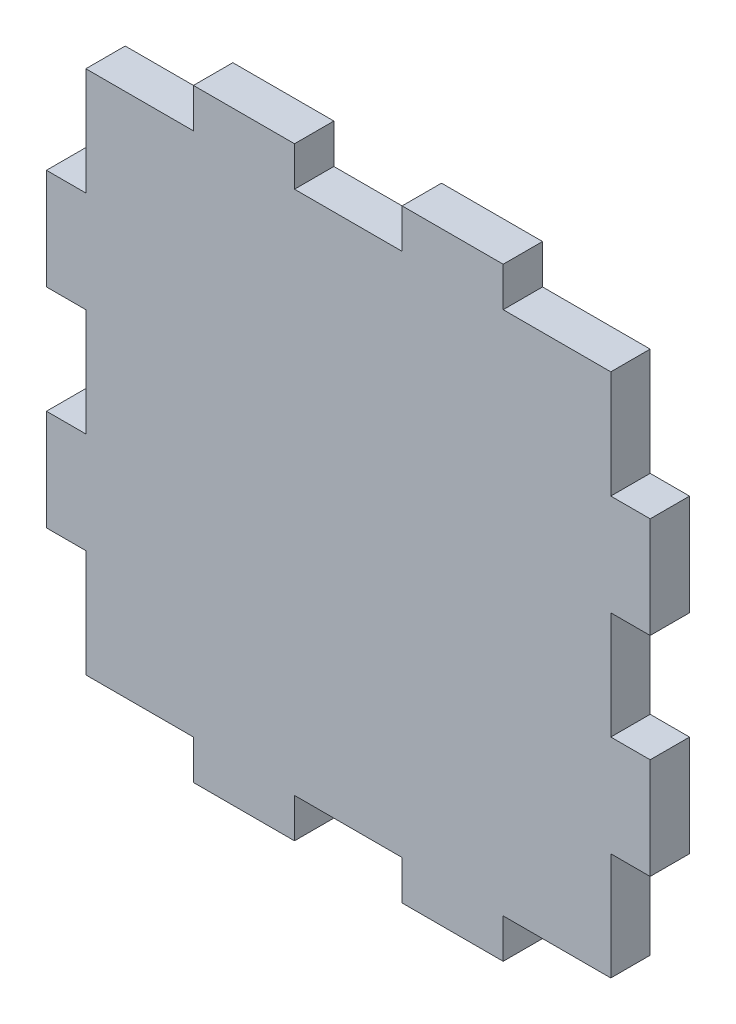
ISO-10303-21;
HEADER;
FILE_DESCRIPTION(('STEP AP214'),'2;1');
FILE_NAME('part.step','',(''),(''),'','','');
FILE_SCHEMA(('AUTOMOTIVE_DESIGN { 1 0 10303 214 1 1 1 1 }'));
ENDSEC;
DATA;
#1=APPLICATION_CONTEXT('core data for automotive mechanical design processes');
#2=APPLICATION_PROTOCOL_DEFINITION('international standard','automotive_design',2000,#1);
#3=PRODUCT_CONTEXT('',#1,'mechanical');
#4=PRODUCT('Part','Part','',(#3));
#5=PRODUCT_RELATED_PRODUCT_CATEGORY('part','',(#4));
#6=PRODUCT_DEFINITION_FORMATION('','',#4);
#7=PRODUCT_DEFINITION_CONTEXT('part definition',#1,'design');
#8=PRODUCT_DEFINITION('design','',#6,#7);
#9=PRODUCT_DEFINITION_SHAPE('','',#8);
#10=(LENGTH_UNIT() NAMED_UNIT(*) SI_UNIT(.MILLI.,.METRE.));
#11=(NAMED_UNIT(*) PLANE_ANGLE_UNIT() SI_UNIT($,.RADIAN.));
#12=(NAMED_UNIT(*) SI_UNIT($,.STERADIAN.) SOLID_ANGLE_UNIT());
#13=UNCERTAINTY_MEASURE_WITH_UNIT(LENGTH_MEASURE(1.E-05),#10,'distance_accuracy_value','');
#14=(GEOMETRIC_REPRESENTATION_CONTEXT(3) GLOBAL_UNCERTAINTY_ASSIGNED_CONTEXT((#13)) GLOBAL_UNIT_ASSIGNED_CONTEXT((#10,
#11,#12)) REPRESENTATION_CONTEXT('',''));
#15=CARTESIAN_POINT('',(0.,0.,0.));
#16=DIRECTION('',(0.,0.,1.));
#17=DIRECTION('',(1.,0.,0.));
#18=AXIS2_PLACEMENT_3D('',#15,#16,#17);
#19=CARTESIAN_POINT('',(0.,-4.09999999999999,3.));
#20=DIRECTION('',(0.,-1.,0.));
#21=DIRECTION('',(0.,0.,-1.));
#22=AXIS2_PLACEMENT_3D('',#19,#20,#21);
#23=PLANE('',#22);
#24=DIRECTION('',(-1.,0.,0.));
#25=VECTOR('',#24,1.);
#26=CARTESIAN_POINT('',(0.,-4.09999999999999,0.));
#27=LINE('',#26,#25);
#28=CARTESIAN_POINT('',(-20.,-4.09999999999999,0.));
#29=VERTEX_POINT('',#28);
#30=CARTESIAN_POINT('',(-23.,-4.09999999999999,0.));
#31=VERTEX_POINT('',#30);
#32=EDGE_CURVE('E318',#29,#31,#27,.T.);
#33=ORIENTED_EDGE('',*,*,#32,.T.);
#34=DIRECTION('',(0.,0.,-1.));
#35=VECTOR('',#34,1.);
#36=CARTESIAN_POINT('',(-23.,-4.09999999999999,3.));
#37=LINE('',#36,#35);
#38=CARTESIAN_POINT('',(-23.,-4.09999999999999,3.));
#39=VERTEX_POINT('',#38);
#40=EDGE_CURVE('E11',#39,#31,#37,.T.);
#41=ORIENTED_EDGE('',*,*,#40,.F.);
#42=DIRECTION('',(-1.,0.,0.));
#43=VECTOR('',#42,1.);
#44=CARTESIAN_POINT('',(0.,-4.09999999999999,3.));
#45=LINE('',#44,#43);
#46=CARTESIAN_POINT('',(-20.,-4.09999999999999,3.));
#47=VERTEX_POINT('',#46);
#48=EDGE_CURVE('E556',#47,#39,#45,.T.);
#49=ORIENTED_EDGE('',*,*,#48,.F.);
#50=DIRECTION('',(0.,0.,-1.));
#51=VECTOR('',#50,1.);
#52=CARTESIAN_POINT('',(-20.,-4.09999999999999,3.));
#53=LINE('',#52,#51);
#54=EDGE_CURVE('E62',#47,#29,#53,.T.);
#55=ORIENTED_EDGE('',*,*,#54,.T.);
#56=EDGE_LOOP('',(#33,#41,#49,#55));
#57=FACE_BOUND('',#56,.T.);
#58=ADVANCED_FACE('F45',(#57),#23,.F.);
#59=CARTESIAN_POINT('',(-23.,0.,3.));
#60=DIRECTION('',(1.,0.,0.));
#61=DIRECTION('',(0.,0.,-1.));
#62=AXIS2_PLACEMENT_3D('',#59,#60,#61);
#63=PLANE('',#62);
#64=DIRECTION('',(0.,-1.,0.));
#65=VECTOR('',#64,1.);
#66=CARTESIAN_POINT('',(-23.,0.,0.));
#67=LINE('',#66,#65);
#68=CARTESIAN_POINT('',(-23.,-11.8,0.));
#69=VERTEX_POINT('',#68);
#70=EDGE_CURVE('E321',#31,#69,#67,.T.);
#71=ORIENTED_EDGE('',*,*,#70,.T.);
#72=DIRECTION('',(0.,0.,-1.));
#73=VECTOR('',#72,1.);
#74=CARTESIAN_POINT('',(-23.,-11.8,3.));
#75=LINE('',#74,#73);
#76=CARTESIAN_POINT('',(-23.,-11.8,3.));
#77=VERTEX_POINT('',#76);
#78=EDGE_CURVE('E54',#77,#69,#75,.T.);
#79=ORIENTED_EDGE('',*,*,#78,.F.);
#80=DIRECTION('',(0.,-1.,0.));
#81=VECTOR('',#80,1.);
#82=CARTESIAN_POINT('',(-23.,0.,3.));
#83=LINE('',#82,#81);
#84=EDGE_CURVE('E184',#39,#77,#83,.T.);
#85=ORIENTED_EDGE('',*,*,#84,.F.);
#86=ORIENTED_EDGE('',*,*,#40,.T.);
#87=EDGE_LOOP('',(#71,#79,#85,#86));
#88=FACE_BOUND('',#87,.T.);
#89=ADVANCED_FACE('F538',(#88),#63,.F.);
#90=CARTESIAN_POINT('',(0.,-11.8,3.));
#91=DIRECTION('',(0.,-1.,0.));
#92=DIRECTION('',(1.,0.,0.));
#93=AXIS2_PLACEMENT_3D('',#90,#91,#92);
#94=PLANE('',#93);
#95=DIRECTION('',(-1.,0.,0.));
#96=VECTOR('',#95,1.);
#97=CARTESIAN_POINT('',(0.,-11.8,0.));
#98=LINE('',#97,#96);
#99=CARTESIAN_POINT('',(-20.,-11.8,0.));
#100=VERTEX_POINT('',#99);
#101=EDGE_CURVE('E325',#100,#69,#98,.T.);
#102=ORIENTED_EDGE('',*,*,#101,.F.);
#103=DIRECTION('',(0.,0.,-1.));
#104=VECTOR('',#103,1.);
#105=CARTESIAN_POINT('',(-20.,-11.8,3.));
#106=LINE('',#105,#104);
#107=CARTESIAN_POINT('',(-20.,-11.8,3.));
#108=VERTEX_POINT('',#107);
#109=EDGE_CURVE('E529',#108,#100,#106,.T.);
#110=ORIENTED_EDGE('',*,*,#109,.F.);
#111=DIRECTION('',(-1.,0.,0.));
#112=VECTOR('',#111,1.);
#113=CARTESIAN_POINT('',(0.,-11.8,3.));
#114=LINE('',#113,#112);
#115=EDGE_CURVE('E537',#108,#77,#114,.T.);
#116=ORIENTED_EDGE('',*,*,#115,.T.);
#117=ORIENTED_EDGE('',*,*,#78,.T.);
#118=EDGE_LOOP('',(#102,#110,#116,#117));
#119=FACE_BOUND('',#118,.T.);
#120=ADVANCED_FACE('F535',(#119),#94,.T.);
#121=CARTESIAN_POINT('',(-20.,0.,3.));
#122=DIRECTION('',(-1.,0.,0.));
#123=DIRECTION('',(0.,0.,1.));
#124=AXIS2_PLACEMENT_3D('',#121,#122,#123);
#125=PLANE('',#124);
#126=DIRECTION('',(0.,1.,0.));
#127=VECTOR('',#126,1.);
#128=CARTESIAN_POINT('',(-20.,0.,0.));
#129=LINE('',#128,#127);
#130=CARTESIAN_POINT('',(-20.,-20.,0.));
#131=VERTEX_POINT('',#130);
#132=EDGE_CURVE('E329',#131,#100,#129,.T.);
#133=ORIENTED_EDGE('',*,*,#132,.F.);
#134=DIRECTION('',(0.,0.,-1.));
#135=VECTOR('',#134,1.);
#136=CARTESIAN_POINT('',(-20.,-20.,3.));
#137=LINE('',#136,#135);
#138=CARTESIAN_POINT('',(-20.,-20.,3.));
#139=VERTEX_POINT('',#138);
#140=EDGE_CURVE('E526',#139,#131,#137,.T.);
#141=ORIENTED_EDGE('',*,*,#140,.F.);
#142=DIRECTION('',(0.,1.,0.));
#143=VECTOR('',#142,1.);
#144=CARTESIAN_POINT('',(-20.,0.,3.));
#145=LINE('',#144,#143);
#146=EDGE_CURVE('E315',#139,#108,#145,.T.);
#147=ORIENTED_EDGE('',*,*,#146,.T.);
#148=ORIENTED_EDGE('',*,*,#109,.T.);
#149=EDGE_LOOP('',(#133,#141,#147,#148));
#150=FACE_BOUND('',#149,.T.);
#151=ADVANCED_FACE('F546',(#150),#125,.T.);
#152=CARTESIAN_POINT('',(0.,-20.,3.));
#153=DIRECTION('',(0.,-1.,0.));
#154=DIRECTION('',(1.,0.,0.));
#155=AXIS2_PLACEMENT_3D('',#152,#153,#154);
#156=PLANE('',#155);
#157=DIRECTION('',(-1.,0.,0.));
#158=VECTOR('',#157,1.);
#159=CARTESIAN_POINT('',(0.,-20.,0.));
#160=LINE('',#159,#158);
#161=CARTESIAN_POINT('',(-11.8,-20.,0.));
#162=VERTEX_POINT('',#161);
#163=EDGE_CURVE('E333',#162,#131,#160,.T.);
#164=ORIENTED_EDGE('',*,*,#163,.F.);
#165=DIRECTION('',(0.,0.,-1.));
#166=VECTOR('',#165,1.);
#167=CARTESIAN_POINT('',(-11.8,-20.,3.));
#168=LINE('',#167,#166);
#169=CARTESIAN_POINT('',(-11.8,-20.,3.));
#170=VERTEX_POINT('',#169);
#171=EDGE_CURVE('E523',#170,#162,#168,.T.);
#172=ORIENTED_EDGE('',*,*,#171,.F.);
#173=DIRECTION('',(-1.,0.,0.));
#174=VECTOR('',#173,1.);
#175=CARTESIAN_POINT('',(0.,-20.,3.));
#176=LINE('',#175,#174);
#177=EDGE_CURVE('E555',#170,#139,#176,.T.);
#178=ORIENTED_EDGE('',*,*,#177,.T.);
#179=ORIENTED_EDGE('',*,*,#140,.T.);
#180=EDGE_LOOP('',(#164,#172,#178,#179));
#181=FACE_BOUND('',#180,.T.);
#182=ADVANCED_FACE('F689',(#181),#156,.T.);
#183=CARTESIAN_POINT('',(-11.8,0.,3.));
#184=DIRECTION('',(1.,0.,0.));
#185=DIRECTION('',(0.,0.,-1.));
#186=AXIS2_PLACEMENT_3D('',#183,#184,#185);
#187=PLANE('',#186);
#188=DIRECTION('',(0.,-1.,0.));
#189=VECTOR('',#188,1.);
#190=CARTESIAN_POINT('',(-11.8,0.,0.));
#191=LINE('',#190,#189);
#192=CARTESIAN_POINT('',(-11.8,-23.,0.));
#193=VERTEX_POINT('',#192);
#194=EDGE_CURVE('E339',#162,#193,#191,.T.);
#195=ORIENTED_EDGE('',*,*,#194,.T.);
#196=DIRECTION('',(0.,0.,-1.));
#197=VECTOR('',#196,1.);
#198=CARTESIAN_POINT('',(-11.8,-23.,3.));
#199=LINE('',#198,#197);
#200=CARTESIAN_POINT('',(-11.8,-23.,3.));
#201=VERTEX_POINT('',#200);
#202=EDGE_CURVE('E519',#201,#193,#199,.T.);
#203=ORIENTED_EDGE('',*,*,#202,.F.);
#204=DIRECTION('',(0.,-1.,0.));
#205=VECTOR('',#204,1.);
#206=CARTESIAN_POINT('',(-11.8,0.,3.));
#207=LINE('',#206,#205);
#208=EDGE_CURVE('E562',#170,#201,#207,.T.);
#209=ORIENTED_EDGE('',*,*,#208,.F.);
#210=ORIENTED_EDGE('',*,*,#171,.T.);
#211=EDGE_LOOP('',(#195,#203,#209,#210));
#212=FACE_BOUND('',#211,.T.);
#213=ADVANCED_FACE('F701',(#212),#187,.F.);
#214=CARTESIAN_POINT('',(0.,-23.,3.));
#215=DIRECTION('',(0.,1.,0.));
#216=DIRECTION('',(0.,0.,1.));
#217=AXIS2_PLACEMENT_3D('',#214,#215,#216);
#218=PLANE('',#217);
#219=DIRECTION('',(1.,0.,0.));
#220=VECTOR('',#219,1.);
#221=CARTESIAN_POINT('',(0.,-23.,0.));
#222=LINE('',#221,#220);
#223=CARTESIAN_POINT('',(-4.09999999999999,-23.,0.));
#224=VERTEX_POINT('',#223);
#225=EDGE_CURVE('E344',#193,#224,#222,.T.);
#226=ORIENTED_EDGE('',*,*,#225,.T.);
#227=DIRECTION('',(0.,0.,-1.));
#228=VECTOR('',#227,1.);
#229=CARTESIAN_POINT('',(-4.09999999999999,-23.,3.));
#230=LINE('',#229,#228);
#231=CARTESIAN_POINT('',(-4.09999999999999,-23.,3.));
#232=VERTEX_POINT('',#231);
#233=EDGE_CURVE('E516',#232,#224,#230,.T.);
#234=ORIENTED_EDGE('',*,*,#233,.F.);
#235=DIRECTION('',(1.,0.,0.));
#236=VECTOR('',#235,1.);
#237=CARTESIAN_POINT('',(0.,-23.,3.));
#238=LINE('',#237,#236);
#239=EDGE_CURVE('E567',#201,#232,#238,.T.);
#240=ORIENTED_EDGE('',*,*,#239,.F.);
#241=ORIENTED_EDGE('',*,*,#202,.T.);
#242=EDGE_LOOP('',(#226,#234,#240,#241));
#243=FACE_BOUND('',#242,.T.);
#244=ADVANCED_FACE('F704',(#243),#218,.F.);
#245=CARTESIAN_POINT('',(-4.09999999999999,0.,3.));
#246=DIRECTION('',(1.,0.,0.));
#247=DIRECTION('',(0.,0.,-1.));
#248=AXIS2_PLACEMENT_3D('',#245,#246,#247);
#249=PLANE('',#248);
#250=DIRECTION('',(0.,-1.,0.));
#251=VECTOR('',#250,1.);
#252=CARTESIAN_POINT('',(-4.09999999999999,0.,0.));
#253=LINE('',#252,#251);
#254=CARTESIAN_POINT('',(-4.09999999999999,-20.,0.));
#255=VERTEX_POINT('',#254);
#256=EDGE_CURVE('E348',#255,#224,#253,.T.);
#257=ORIENTED_EDGE('',*,*,#256,.F.);
#258=DIRECTION('',(0.,0.,-1.));
#259=VECTOR('',#258,1.);
#260=CARTESIAN_POINT('',(-4.09999999999999,-20.,3.));
#261=LINE('',#260,#259);
#262=CARTESIAN_POINT('',(-4.09999999999999,-20.,3.));
#263=VERTEX_POINT('',#262);
#264=EDGE_CURVE('E513',#263,#255,#261,.T.);
#265=ORIENTED_EDGE('',*,*,#264,.F.);
#266=DIRECTION('',(0.,-1.,0.));
#267=VECTOR('',#266,1.);
#268=CARTESIAN_POINT('',(-4.09999999999999,0.,3.));
#269=LINE('',#268,#267);
#270=EDGE_CURVE('E570',#263,#232,#269,.T.);
#271=ORIENTED_EDGE('',*,*,#270,.T.);
#272=ORIENTED_EDGE('',*,*,#233,.T.);
#273=EDGE_LOOP('',(#257,#265,#271,#272));
#274=FACE_BOUND('',#273,.T.);
#275=ADVANCED_FACE('F708',(#274),#249,.T.);
#276=CARTESIAN_POINT('',(4.1,-20.,0.));
#277=VERTEX_POINT('',#276);
#278=EDGE_CURVE('E341',#277,#255,#160,.T.);
#279=ORIENTED_EDGE('',*,*,#278,.F.);
#280=DIRECTION('',(0.,0.,-1.));
#281=VECTOR('',#280,1.);
#282=CARTESIAN_POINT('',(4.1,-20.,3.));
#283=LINE('',#282,#281);
#284=CARTESIAN_POINT('',(4.1,-20.,3.));
#285=VERTEX_POINT('',#284);
#286=EDGE_CURVE('E510',#285,#277,#283,.T.);
#287=ORIENTED_EDGE('',*,*,#286,.F.);
#288=EDGE_CURVE('E564',#285,#263,#176,.T.);
#289=ORIENTED_EDGE('',*,*,#288,.T.);
#290=ORIENTED_EDGE('',*,*,#264,.T.);
#291=EDGE_LOOP('',(#279,#287,#289,#290));
#292=FACE_BOUND('',#291,.T.);
#293=ADVANCED_FACE('F712',(#292),#156,.T.);
#294=CARTESIAN_POINT('',(4.1,0.,3.));
#295=DIRECTION('',(1.,0.,0.));
#296=DIRECTION('',(0.,0.,-1.));
#297=AXIS2_PLACEMENT_3D('',#294,#295,#296);
#298=PLANE('',#297);
#299=DIRECTION('',(0.,-1.,0.));
#300=VECTOR('',#299,1.);
#301=CARTESIAN_POINT('',(4.1,0.,0.));
#302=LINE('',#301,#300);
#303=CARTESIAN_POINT('',(4.1,-23.,0.));
#304=VERTEX_POINT('',#303);
#305=EDGE_CURVE('E352',#277,#304,#302,.T.);
#306=ORIENTED_EDGE('',*,*,#305,.T.);
#307=DIRECTION('',(0.,0.,-1.));
#308=VECTOR('',#307,1.);
#309=CARTESIAN_POINT('',(4.1,-23.,3.));
#310=LINE('',#309,#308);
#311=CARTESIAN_POINT('',(4.1,-23.,3.));
#312=VERTEX_POINT('',#311);
#313=EDGE_CURVE('E506',#312,#304,#310,.T.);
#314=ORIENTED_EDGE('',*,*,#313,.F.);
#315=DIRECTION('',(0.,-1.,0.));
#316=VECTOR('',#315,1.);
#317=CARTESIAN_POINT('',(4.1,0.,3.));
#318=LINE('',#317,#316);
#319=EDGE_CURVE('E574',#285,#312,#318,.T.);
#320=ORIENTED_EDGE('',*,*,#319,.F.);
#321=ORIENTED_EDGE('',*,*,#286,.T.);
#322=EDGE_LOOP('',(#306,#314,#320,#321));
#323=FACE_BOUND('',#322,.T.);
#324=ADVANCED_FACE('F714',(#323),#298,.F.);
#325=CARTESIAN_POINT('',(0.,-23.,3.));
#326=DIRECTION('',(0.,1.,0.));
#327=DIRECTION('',(-1.,0.,0.));
#328=AXIS2_PLACEMENT_3D('',#325,#326,#327);
#329=PLANE('',#328);
#330=DIRECTION('',(1.,0.,0.));
#331=VECTOR('',#330,1.);
#332=CARTESIAN_POINT('',(0.,-23.,0.));
#333=LINE('',#332,#331);
#334=CARTESIAN_POINT('',(11.8,-23.,0.));
#335=VERTEX_POINT('',#334);
#336=EDGE_CURVE('E355',#304,#335,#333,.T.);
#337=ORIENTED_EDGE('',*,*,#336,.T.);
#338=DIRECTION('',(0.,0.,-1.));
#339=VECTOR('',#338,1.);
#340=CARTESIAN_POINT('',(11.8,-23.,3.));
#341=LINE('',#340,#339);
#342=CARTESIAN_POINT('',(11.8,-23.,3.));
#343=VERTEX_POINT('',#342);
#344=EDGE_CURVE('E503',#343,#335,#341,.T.);
#345=ORIENTED_EDGE('',*,*,#344,.F.);
#346=DIRECTION('',(1.,0.,0.));
#347=VECTOR('',#346,1.);
#348=CARTESIAN_POINT('',(0.,-23.,3.));
#349=LINE('',#348,#347);
#350=EDGE_CURVE('E577',#312,#343,#349,.T.);
#351=ORIENTED_EDGE('',*,*,#350,.F.);
#352=ORIENTED_EDGE('',*,*,#313,.T.);
#353=EDGE_LOOP('',(#337,#345,#351,#352));
#354=FACE_BOUND('',#353,.T.);
#355=ADVANCED_FACE('F717',(#354),#329,.F.);
#356=CARTESIAN_POINT('',(11.8,0.,3.));
#357=DIRECTION('',(1.,0.,0.));
#358=DIRECTION('',(0.,0.,-1.));
#359=AXIS2_PLACEMENT_3D('',#356,#357,#358);
#360=PLANE('',#359);
#361=DIRECTION('',(0.,-1.,0.));
#362=VECTOR('',#361,1.);
#363=CARTESIAN_POINT('',(11.8,0.,0.));
#364=LINE('',#363,#362);
#365=CARTESIAN_POINT('',(11.8,-20.,0.));
#366=VERTEX_POINT('',#365);
#367=EDGE_CURVE('E359',#366,#335,#364,.T.);
#368=ORIENTED_EDGE('',*,*,#367,.F.);
#369=DIRECTION('',(0.,0.,-1.));
#370=VECTOR('',#369,1.);
#371=CARTESIAN_POINT('',(11.8,-20.,3.));
#372=LINE('',#371,#370);
#373=CARTESIAN_POINT('',(11.8,-20.,3.));
#374=VERTEX_POINT('',#373);
#375=EDGE_CURVE('E500',#374,#366,#372,.T.);
#376=ORIENTED_EDGE('',*,*,#375,.F.);
#377=DIRECTION('',(0.,-1.,0.));
#378=VECTOR('',#377,1.);
#379=CARTESIAN_POINT('',(11.8,0.,3.));
#380=LINE('',#379,#378);
#381=EDGE_CURVE('E580',#374,#343,#380,.T.);
#382=ORIENTED_EDGE('',*,*,#381,.T.);
#383=ORIENTED_EDGE('',*,*,#344,.T.);
#384=EDGE_LOOP('',(#368,#376,#382,#383));
#385=FACE_BOUND('',#384,.T.);
#386=ADVANCED_FACE('F721',(#385),#360,.T.);
#387=CARTESIAN_POINT('',(20.,-20.,0.));
#388=VERTEX_POINT('',#387);
#389=EDGE_CURVE('E340',#388,#366,#160,.T.);
#390=ORIENTED_EDGE('',*,*,#389,.F.);
#391=DIRECTION('',(0.,0.,-1.));
#392=VECTOR('',#391,1.);
#393=CARTESIAN_POINT('',(20.,-20.,3.));
#394=LINE('',#393,#392);
#395=CARTESIAN_POINT('',(20.,-20.,3.));
#396=VERTEX_POINT('',#395);
#397=EDGE_CURVE('E497',#396,#388,#394,.T.);
#398=ORIENTED_EDGE('',*,*,#397,.F.);
#399=EDGE_CURVE('E563',#396,#374,#176,.T.);
#400=ORIENTED_EDGE('',*,*,#399,.T.);
#401=ORIENTED_EDGE('',*,*,#375,.T.);
#402=EDGE_LOOP('',(#390,#398,#400,#401));
#403=FACE_BOUND('',#402,.T.);
#404=ADVANCED_FACE('F725',(#403),#156,.T.);
#405=CARTESIAN_POINT('',(20.,0.,3.));
#406=DIRECTION('',(-1.,0.,0.));
#407=DIRECTION('',(0.,0.,1.));
#408=AXIS2_PLACEMENT_3D('',#405,#406,#407);
#409=PLANE('',#408);
#410=DIRECTION('',(0.,1.,0.));
#411=VECTOR('',#410,1.);
#412=CARTESIAN_POINT('',(20.,0.,0.));
#413=LINE('',#412,#411);
#414=CARTESIAN_POINT('',(20.,-11.8,0.));
#415=VERTEX_POINT('',#414);
#416=EDGE_CURVE('E363',#388,#415,#413,.T.);
#417=ORIENTED_EDGE('',*,*,#416,.T.);
#418=DIRECTION('',(0.,0.,-1.));
#419=VECTOR('',#418,1.);
#420=CARTESIAN_POINT('',(20.,-11.8,3.));
#421=LINE('',#420,#419);
#422=CARTESIAN_POINT('',(20.,-11.8,3.));
#423=VERTEX_POINT('',#422);
#424=EDGE_CURVE('E493',#423,#415,#421,.T.);
#425=ORIENTED_EDGE('',*,*,#424,.F.);
#426=DIRECTION('',(0.,1.,0.));
#427=VECTOR('',#426,1.);
#428=CARTESIAN_POINT('',(20.,0.,3.));
#429=LINE('',#428,#427);
#430=EDGE_CURVE('E584',#396,#423,#429,.T.);
#431=ORIENTED_EDGE('',*,*,#430,.F.);
#432=ORIENTED_EDGE('',*,*,#397,.T.);
#433=EDGE_LOOP('',(#417,#425,#431,#432));
#434=FACE_BOUND('',#433,.T.);
#435=ADVANCED_FACE('F729',(#434),#409,.F.);
#436=CARTESIAN_POINT('',(0.,-11.8,3.));
#437=DIRECTION('',(0.,1.,0.));
#438=DIRECTION('',(-1.,0.,0.));
#439=AXIS2_PLACEMENT_3D('',#436,#437,#438);
#440=PLANE('',#439);
#441=DIRECTION('',(1.,0.,0.));
#442=VECTOR('',#441,1.);
#443=CARTESIAN_POINT('',(0.,-11.8,0.));
#444=LINE('',#443,#442);
#445=CARTESIAN_POINT('',(23.,-11.8,0.));
#446=VERTEX_POINT('',#445);
#447=EDGE_CURVE('E366',#415,#446,#444,.T.);
#448=ORIENTED_EDGE('',*,*,#447,.T.);
#449=DIRECTION('',(0.,0.,-1.));
#450=VECTOR('',#449,1.);
#451=CARTESIAN_POINT('',(23.,-11.8,3.));
#452=LINE('',#451,#450);
#453=CARTESIAN_POINT('',(23.,-11.8,3.));
#454=VERTEX_POINT('',#453);
#455=EDGE_CURVE('E490',#454,#446,#452,.T.);
#456=ORIENTED_EDGE('',*,*,#455,.F.);
#457=DIRECTION('',(1.,0.,0.));
#458=VECTOR('',#457,1.);
#459=CARTESIAN_POINT('',(0.,-11.8,3.));
#460=LINE('',#459,#458);
#461=EDGE_CURVE('E587',#423,#454,#460,.T.);
#462=ORIENTED_EDGE('',*,*,#461,.F.);
#463=ORIENTED_EDGE('',*,*,#424,.T.);
#464=EDGE_LOOP('',(#448,#456,#462,#463));
#465=FACE_BOUND('',#464,.T.);
#466=ADVANCED_FACE('F731',(#465),#440,.F.);
#467=CARTESIAN_POINT('',(23.,0.,3.));
#468=DIRECTION('',(1.,0.,0.));
#469=DIRECTION('',(0.,0.,-1.));
#470=AXIS2_PLACEMENT_3D('',#467,#468,#469);
#471=PLANE('',#470);
#472=DIRECTION('',(0.,-1.,0.));
#473=VECTOR('',#472,1.);
#474=CARTESIAN_POINT('',(23.,0.,0.));
#475=LINE('',#474,#473);
#476=CARTESIAN_POINT('',(23.,-4.09999999999999,0.));
#477=VERTEX_POINT('',#476);
#478=EDGE_CURVE('E372',#477,#446,#475,.T.);
#479=ORIENTED_EDGE('',*,*,#478,.F.);
#480=DIRECTION('',(0.,0.,-1.));
#481=VECTOR('',#480,1.);
#482=CARTESIAN_POINT('',(23.,-4.09999999999999,3.));
#483=LINE('',#482,#481);
#484=CARTESIAN_POINT('',(23.,-4.09999999999999,3.));
#485=VERTEX_POINT('',#484);
#486=EDGE_CURVE('E487',#485,#477,#483,.T.);
#487=ORIENTED_EDGE('',*,*,#486,.F.);
#488=DIRECTION('',(0.,-1.,0.));
#489=VECTOR('',#488,1.);
#490=CARTESIAN_POINT('',(23.,0.,3.));
#491=LINE('',#490,#489);
#492=EDGE_CURVE('E592',#485,#454,#491,.T.);
#493=ORIENTED_EDGE('',*,*,#492,.T.);
#494=ORIENTED_EDGE('',*,*,#455,.T.);
#495=EDGE_LOOP('',(#479,#487,#493,#494));
#496=FACE_BOUND('',#495,.T.);
#497=ADVANCED_FACE('F734',(#496),#471,.T.);
#498=CARTESIAN_POINT('',(0.,-4.09999999999999,3.));
#499=DIRECTION('',(0.,1.,0.));
#500=DIRECTION('',(0.,0.,1.));
#501=AXIS2_PLACEMENT_3D('',#498,#499,#500);
#502=PLANE('',#501);
#503=DIRECTION('',(1.,0.,0.));
#504=VECTOR('',#503,1.);
#505=CARTESIAN_POINT('',(0.,-4.09999999999999,0.));
#506=LINE('',#505,#504);
#507=CARTESIAN_POINT('',(20.,-4.09999999999999,0.));
#508=VERTEX_POINT('',#507);
#509=EDGE_CURVE('E376',#508,#477,#506,.T.);
#510=ORIENTED_EDGE('',*,*,#509,.F.);
#511=DIRECTION('',(0.,0.,-1.));
#512=VECTOR('',#511,1.);
#513=CARTESIAN_POINT('',(20.,-4.09999999999999,3.));
#514=LINE('',#513,#512);
#515=CARTESIAN_POINT('',(20.,-4.09999999999999,3.));
#516=VERTEX_POINT('',#515);
#517=EDGE_CURVE('E484',#516,#508,#514,.T.);
#518=ORIENTED_EDGE('',*,*,#517,.F.);
#519=DIRECTION('',(1.,0.,0.));
#520=VECTOR('',#519,1.);
#521=CARTESIAN_POINT('',(0.,-4.09999999999999,3.));
#522=LINE('',#521,#520);
#523=EDGE_CURVE('E596',#516,#485,#522,.T.);
#524=ORIENTED_EDGE('',*,*,#523,.T.);
#525=ORIENTED_EDGE('',*,*,#486,.T.);
#526=EDGE_LOOP('',(#510,#518,#524,#525));
#527=FACE_BOUND('',#526,.T.);
#528=ADVANCED_FACE('F738',(#527),#502,.T.);
#529=CARTESIAN_POINT('',(20.,4.1,0.));
#530=VERTEX_POINT('',#529);
#531=EDGE_CURVE('E368',#508,#530,#413,.T.);
#532=ORIENTED_EDGE('',*,*,#531,.T.);
#533=DIRECTION('',(0.,0.,-1.));
#534=VECTOR('',#533,1.);
#535=CARTESIAN_POINT('',(20.,4.1,3.));
#536=LINE('',#535,#534);
#537=CARTESIAN_POINT('',(20.,4.1,3.));
#538=VERTEX_POINT('',#537);
#539=EDGE_CURVE('E480',#538,#530,#536,.T.);
#540=ORIENTED_EDGE('',*,*,#539,.F.);
#541=EDGE_CURVE('E589',#516,#538,#429,.T.);
#542=ORIENTED_EDGE('',*,*,#541,.F.);
#543=ORIENTED_EDGE('',*,*,#517,.T.);
#544=EDGE_LOOP('',(#532,#540,#542,#543));
#545=FACE_BOUND('',#544,.T.);
#546=ADVANCED_FACE('F742',(#545),#409,.F.);
#547=CARTESIAN_POINT('',(0.,4.10000000000001,3.));
#548=DIRECTION('',(0.,1.,0.));
#549=DIRECTION('',(-1.,0.,0.));
#550=AXIS2_PLACEMENT_3D('',#547,#548,#549);
#551=PLANE('',#550);
#552=DIRECTION('',(1.,0.,0.));
#553=VECTOR('',#552,1.);
#554=CARTESIAN_POINT('',(0.,4.10000000000001,0.));
#555=LINE('',#554,#553);
#556=CARTESIAN_POINT('',(23.,4.1,0.));
#557=VERTEX_POINT('',#556);
#558=EDGE_CURVE('E380',#530,#557,#555,.T.);
#559=ORIENTED_EDGE('',*,*,#558,.T.);
#560=DIRECTION('',(0.,0.,-1.));
#561=VECTOR('',#560,1.);
#562=CARTESIAN_POINT('',(23.,4.1,3.));
#563=LINE('',#562,#561);
#564=CARTESIAN_POINT('',(23.,4.1,3.));
#565=VERTEX_POINT('',#564);
#566=EDGE_CURVE('E477',#565,#557,#563,.T.);
#567=ORIENTED_EDGE('',*,*,#566,.F.);
#568=DIRECTION('',(1.,0.,0.));
#569=VECTOR('',#568,1.);
#570=CARTESIAN_POINT('',(0.,4.10000000000001,3.));
#571=LINE('',#570,#569);
#572=EDGE_CURVE('E600',#538,#565,#571,.T.);
#573=ORIENTED_EDGE('',*,*,#572,.F.);
#574=ORIENTED_EDGE('',*,*,#539,.T.);
#575=EDGE_LOOP('',(#559,#567,#573,#574));
#576=FACE_BOUND('',#575,.T.);
#577=ADVANCED_FACE('F744',(#576),#551,.F.);
#578=CARTESIAN_POINT('',(23.,0.,3.));
#579=DIRECTION('',(1.,0.,0.));
#580=DIRECTION('',(0.,1.,0.));
#581=AXIS2_PLACEMENT_3D('',#578,#579,#580);
#582=PLANE('',#581);
#583=DIRECTION('',(0.,-1.,0.));
#584=VECTOR('',#583,1.);
#585=CARTESIAN_POINT('',(23.,0.,0.));
#586=LINE('',#585,#584);
#587=CARTESIAN_POINT('',(23.,11.8,0.));
#588=VERTEX_POINT('',#587);
#589=EDGE_CURVE('E384',#588,#557,#586,.T.);
#590=ORIENTED_EDGE('',*,*,#589,.F.);
#591=DIRECTION('',(0.,0.,-1.));
#592=VECTOR('',#591,1.);
#593=CARTESIAN_POINT('',(23.,11.8,3.));
#594=LINE('',#593,#592);
#595=CARTESIAN_POINT('',(23.,11.8,3.));
#596=VERTEX_POINT('',#595);
#597=EDGE_CURVE('E474',#596,#588,#594,.T.);
#598=ORIENTED_EDGE('',*,*,#597,.F.);
#599=DIRECTION('',(0.,-1.,0.));
#600=VECTOR('',#599,1.);
#601=CARTESIAN_POINT('',(23.,0.,3.));
#602=LINE('',#601,#600);
#603=EDGE_CURVE('E603',#596,#565,#602,.T.);
#604=ORIENTED_EDGE('',*,*,#603,.T.);
#605=ORIENTED_EDGE('',*,*,#566,.T.);
#606=EDGE_LOOP('',(#590,#598,#604,#605));
#607=FACE_BOUND('',#606,.T.);
#608=ADVANCED_FACE('F747',(#607),#582,.T.);
#609=CARTESIAN_POINT('',(0.,11.8,3.));
#610=DIRECTION('',(0.,1.,0.));
#611=DIRECTION('',(0.,0.,1.));
#612=AXIS2_PLACEMENT_3D('',#609,#610,#611);
#613=PLANE('',#612);
#614=DIRECTION('',(1.,0.,0.));
#615=VECTOR('',#614,1.);
#616=CARTESIAN_POINT('',(0.,11.8,0.));
#617=LINE('',#616,#615);
#618=CARTESIAN_POINT('',(20.,11.8,0.));
#619=VERTEX_POINT('',#618);
#620=EDGE_CURVE('E388',#619,#588,#617,.T.);
#621=ORIENTED_EDGE('',*,*,#620,.F.);
#622=DIRECTION('',(0.,0.,-1.));
#623=VECTOR('',#622,1.);
#624=CARTESIAN_POINT('',(20.,11.8,3.));
#625=LINE('',#624,#623);
#626=CARTESIAN_POINT('',(20.,11.8,3.));
#627=VERTEX_POINT('',#626);
#628=EDGE_CURVE('E471',#627,#619,#625,.T.);
#629=ORIENTED_EDGE('',*,*,#628,.F.);
#630=DIRECTION('',(1.,0.,0.));
#631=VECTOR('',#630,1.);
#632=CARTESIAN_POINT('',(0.,11.8,3.));
#633=LINE('',#632,#631);
#634=EDGE_CURVE('E607',#627,#596,#633,.T.);
#635=ORIENTED_EDGE('',*,*,#634,.T.);
#636=ORIENTED_EDGE('',*,*,#597,.T.);
#637=EDGE_LOOP('',(#621,#629,#635,#636));
#638=FACE_BOUND('',#637,.T.);
#639=ADVANCED_FACE('F751',(#638),#613,.T.);
#640=CARTESIAN_POINT('',(20.,20.,0.));
#641=VERTEX_POINT('',#640);
#642=EDGE_CURVE('E367',#619,#641,#413,.T.);
#643=ORIENTED_EDGE('',*,*,#642,.T.);
#644=DIRECTION('',(0.,0.,-1.));
#645=VECTOR('',#644,1.);
#646=CARTESIAN_POINT('',(20.,20.,3.));
#647=LINE('',#646,#645);
#648=CARTESIAN_POINT('',(20.,20.,3.));
#649=VERTEX_POINT('',#648);
#650=EDGE_CURVE('E467',#649,#641,#647,.T.);
#651=ORIENTED_EDGE('',*,*,#650,.F.);
#652=EDGE_CURVE('E588',#627,#649,#429,.T.);
#653=ORIENTED_EDGE('',*,*,#652,.F.);
#654=ORIENTED_EDGE('',*,*,#628,.T.);
#655=EDGE_LOOP('',(#643,#651,#653,#654));
#656=FACE_BOUND('',#655,.T.);
#657=ADVANCED_FACE('F755',(#656),#409,.F.);
#658=CARTESIAN_POINT('',(0.,20.,3.));
#659=DIRECTION('',(0.,-1.,0.));
#660=DIRECTION('',(1.,0.,0.));
#661=AXIS2_PLACEMENT_3D('',#658,#659,#660);
#662=PLANE('',#661);
#663=DIRECTION('',(-1.,0.,0.));
#664=VECTOR('',#663,1.);
#665=CARTESIAN_POINT('',(0.,20.,0.));
#666=LINE('',#665,#664);
#667=CARTESIAN_POINT('',(11.8,20.,0.));
#668=VERTEX_POINT('',#667);
#669=EDGE_CURVE('E392',#641,#668,#666,.T.);
#670=ORIENTED_EDGE('',*,*,#669,.T.);
#671=DIRECTION('',(0.,0.,-1.));
#672=VECTOR('',#671,1.);
#673=CARTESIAN_POINT('',(11.8,20.,3.));
#674=LINE('',#673,#672);
#675=CARTESIAN_POINT('',(11.8,20.,3.));
#676=VERTEX_POINT('',#675);
#677=EDGE_CURVE('E463',#676,#668,#674,.T.);
#678=ORIENTED_EDGE('',*,*,#677,.F.);
#679=DIRECTION('',(-1.,0.,0.));
#680=VECTOR('',#679,1.);
#681=CARTESIAN_POINT('',(0.,20.,3.));
#682=LINE('',#681,#680);
#683=EDGE_CURVE('E611',#649,#676,#682,.T.);
#684=ORIENTED_EDGE('',*,*,#683,.F.);
#685=ORIENTED_EDGE('',*,*,#650,.T.);
#686=EDGE_LOOP('',(#670,#678,#684,#685));
#687=FACE_BOUND('',#686,.T.);
#688=ADVANCED_FACE('F759',(#687),#662,.F.);
#689=CARTESIAN_POINT('',(11.8,0.,3.));
#690=DIRECTION('',(-1.,0.,0.));
#691=DIRECTION('',(0.,0.,1.));
#692=AXIS2_PLACEMENT_3D('',#689,#690,#691);
#693=PLANE('',#692);
#694=DIRECTION('',(0.,1.,0.));
#695=VECTOR('',#694,1.);
#696=CARTESIAN_POINT('',(11.8,0.,0.));
#697=LINE('',#696,#695);
#698=CARTESIAN_POINT('',(11.8,23.,0.));
#699=VERTEX_POINT('',#698);
#700=EDGE_CURVE('E395',#668,#699,#697,.T.);
#701=ORIENTED_EDGE('',*,*,#700,.T.);
#702=DIRECTION('',(0.,0.,-1.));
#703=VECTOR('',#702,1.);
#704=CARTESIAN_POINT('',(11.8,23.,3.));
#705=LINE('',#704,#703);
#706=CARTESIAN_POINT('',(11.8,23.,3.));
#707=VERTEX_POINT('',#706);
#708=EDGE_CURVE('E460',#707,#699,#705,.T.);
#709=ORIENTED_EDGE('',*,*,#708,.F.);
#710=DIRECTION('',(0.,1.,0.));
#711=VECTOR('',#710,1.);
#712=CARTESIAN_POINT('',(11.8,0.,3.));
#713=LINE('',#712,#711);
#714=EDGE_CURVE('E614',#676,#707,#713,.T.);
#715=ORIENTED_EDGE('',*,*,#714,.F.);
#716=ORIENTED_EDGE('',*,*,#677,.T.);
#717=EDGE_LOOP('',(#701,#709,#715,#716));
#718=FACE_BOUND('',#717,.T.);
#719=ADVANCED_FACE('F761',(#718),#693,.F.);
#720=CARTESIAN_POINT('',(0.,23.,3.));
#721=DIRECTION('',(0.,1.,0.));
#722=DIRECTION('',(-1.,0.,0.));
#723=AXIS2_PLACEMENT_3D('',#720,#721,#722);
#724=PLANE('',#723);
#725=DIRECTION('',(1.,0.,0.));
#726=VECTOR('',#725,1.);
#727=CARTESIAN_POINT('',(0.,23.,0.));
#728=LINE('',#727,#726);
#729=CARTESIAN_POINT('',(4.1,23.,0.));
#730=VERTEX_POINT('',#729);
#731=EDGE_CURVE('E401',#730,#699,#728,.T.);
#732=ORIENTED_EDGE('',*,*,#731,.F.);
#733=DIRECTION('',(0.,0.,-1.));
#734=VECTOR('',#733,1.);
#735=CARTESIAN_POINT('',(4.1,23.,3.));
#736=LINE('',#735,#734);
#737=CARTESIAN_POINT('',(4.1,23.,3.));
#738=VERTEX_POINT('',#737);
#739=EDGE_CURVE('E457',#738,#730,#736,.T.);
#740=ORIENTED_EDGE('',*,*,#739,.F.);
#741=DIRECTION('',(1.,0.,0.));
#742=VECTOR('',#741,1.);
#743=CARTESIAN_POINT('',(0.,23.,3.));
#744=LINE('',#743,#742);
#745=EDGE_CURVE('E619',#738,#707,#744,.T.);
#746=ORIENTED_EDGE('',*,*,#745,.T.);
#747=ORIENTED_EDGE('',*,*,#708,.T.);
#748=EDGE_LOOP('',(#732,#740,#746,#747));
#749=FACE_BOUND('',#748,.T.);
#750=ADVANCED_FACE('F764',(#749),#724,.T.);
#751=CARTESIAN_POINT('',(4.1,0.,3.));
#752=DIRECTION('',(-1.,0.,0.));
#753=DIRECTION('',(0.,0.,1.));
#754=AXIS2_PLACEMENT_3D('',#751,#752,#753);
#755=PLANE('',#754);
#756=DIRECTION('',(0.,1.,0.));
#757=VECTOR('',#756,1.);
#758=CARTESIAN_POINT('',(4.1,0.,0.));
#759=LINE('',#758,#757);
#760=CARTESIAN_POINT('',(4.1,20.,0.));
#761=VERTEX_POINT('',#760);
#762=EDGE_CURVE('E405',#761,#730,#759,.T.);
#763=ORIENTED_EDGE('',*,*,#762,.F.);
#764=DIRECTION('',(0.,0.,-1.));
#765=VECTOR('',#764,1.);
#766=CARTESIAN_POINT('',(4.1,20.,3.));
#767=LINE('',#766,#765);
#768=CARTESIAN_POINT('',(4.1,20.,3.));
#769=VERTEX_POINT('',#768);
#770=EDGE_CURVE('E454',#769,#761,#767,.T.);
#771=ORIENTED_EDGE('',*,*,#770,.F.);
#772=DIRECTION('',(0.,1.,0.));
#773=VECTOR('',#772,1.);
#774=CARTESIAN_POINT('',(4.1,0.,3.));
#775=LINE('',#774,#773);
#776=EDGE_CURVE('E623',#769,#738,#775,.T.);
#777=ORIENTED_EDGE('',*,*,#776,.T.);
#778=ORIENTED_EDGE('',*,*,#739,.T.);
#779=EDGE_LOOP('',(#763,#771,#777,#778));
#780=FACE_BOUND('',#779,.T.);
#781=ADVANCED_FACE('F768',(#780),#755,.T.);
#782=CARTESIAN_POINT('',(-4.1,20.,0.));
#783=VERTEX_POINT('',#782);
#784=EDGE_CURVE('E397',#761,#783,#666,.T.);
#785=ORIENTED_EDGE('',*,*,#784,.T.);
#786=DIRECTION('',(0.,0.,-1.));
#787=VECTOR('',#786,1.);
#788=CARTESIAN_POINT('',(-4.1,20.,3.));
#789=LINE('',#788,#787);
#790=CARTESIAN_POINT('',(-4.1,20.,3.));
#791=VERTEX_POINT('',#790);
#792=EDGE_CURVE('E450',#791,#783,#789,.T.);
#793=ORIENTED_EDGE('',*,*,#792,.F.);
#794=EDGE_CURVE('E616',#769,#791,#682,.T.);
#795=ORIENTED_EDGE('',*,*,#794,.F.);
#796=ORIENTED_EDGE('',*,*,#770,.T.);
#797=EDGE_LOOP('',(#785,#793,#795,#796));
#798=FACE_BOUND('',#797,.T.);
#799=ADVANCED_FACE('F654',(#798),#662,.F.);
#800=CARTESIAN_POINT('',(-4.1,0.,3.));
#801=DIRECTION('',(-1.,0.,0.));
#802=DIRECTION('',(0.,0.,1.));
#803=AXIS2_PLACEMENT_3D('',#800,#801,#802);
#804=PLANE('',#803);
#805=DIRECTION('',(0.,1.,0.));
#806=VECTOR('',#805,1.);
#807=CARTESIAN_POINT('',(-4.1,0.,0.));
#808=LINE('',#807,#806);
#809=CARTESIAN_POINT('',(-4.1,23.,0.));
#810=VERTEX_POINT('',#809);
#811=EDGE_CURVE('E409',#783,#810,#808,.T.);
#812=ORIENTED_EDGE('',*,*,#811,.T.);
#813=DIRECTION('',(0.,0.,-1.));
#814=VECTOR('',#813,1.);
#815=CARTESIAN_POINT('',(-4.1,23.,3.));
#816=LINE('',#815,#814);
#817=CARTESIAN_POINT('',(-4.1,23.,3.));
#818=VERTEX_POINT('',#817);
#819=EDGE_CURVE('E447',#818,#810,#816,.T.);
#820=ORIENTED_EDGE('',*,*,#819,.F.);
#821=DIRECTION('',(0.,1.,0.));
#822=VECTOR('',#821,1.);
#823=CARTESIAN_POINT('',(-4.1,0.,3.));
#824=LINE('',#823,#822);
#825=EDGE_CURVE('E627',#791,#818,#824,.T.);
#826=ORIENTED_EDGE('',*,*,#825,.F.);
#827=ORIENTED_EDGE('',*,*,#792,.T.);
#828=EDGE_LOOP('',(#812,#820,#826,#827));
#829=FACE_BOUND('',#828,.T.);
#830=ADVANCED_FACE('F658',(#829),#804,.F.);
#831=CARTESIAN_POINT('',(0.,23.,3.));
#832=DIRECTION('',(0.,1.,0.));
#833=DIRECTION('',(0.,0.,1.));
#834=AXIS2_PLACEMENT_3D('',#831,#832,#833);
#835=PLANE('',#834);
#836=DIRECTION('',(1.,0.,0.));
#837=VECTOR('',#836,1.);
#838=CARTESIAN_POINT('',(0.,23.,0.));
#839=LINE('',#838,#837);
#840=CARTESIAN_POINT('',(-11.8,23.,0.));
#841=VERTEX_POINT('',#840);
#842=EDGE_CURVE('E413',#841,#810,#839,.T.);
#843=ORIENTED_EDGE('',*,*,#842,.F.);
#844=DIRECTION('',(0.,0.,-1.));
#845=VECTOR('',#844,1.);
#846=CARTESIAN_POINT('',(-11.8,23.,3.));
#847=LINE('',#846,#845);
#848=CARTESIAN_POINT('',(-11.8,23.,3.));
#849=VERTEX_POINT('',#848);
#850=EDGE_CURVE('E444',#849,#841,#847,.T.);
#851=ORIENTED_EDGE('',*,*,#850,.F.);
#852=DIRECTION('',(1.,0.,0.));
#853=VECTOR('',#852,1.);
#854=CARTESIAN_POINT('',(0.,23.,3.));
#855=LINE('',#854,#853);
#856=EDGE_CURVE('E630',#849,#818,#855,.T.);
#857=ORIENTED_EDGE('',*,*,#856,.T.);
#858=ORIENTED_EDGE('',*,*,#819,.T.);
#859=EDGE_LOOP('',(#843,#851,#857,#858));
#860=FACE_BOUND('',#859,.T.);
#861=ADVANCED_FACE('F661',(#860),#835,.T.);
#862=CARTESIAN_POINT('',(-11.8,0.,3.));
#863=DIRECTION('',(-1.,0.,0.));
#864=DIRECTION('',(0.,0.,1.));
#865=AXIS2_PLACEMENT_3D('',#862,#863,#864);
#866=PLANE('',#865);
#867=DIRECTION('',(0.,1.,0.));
#868=VECTOR('',#867,1.);
#869=CARTESIAN_POINT('',(-11.8,0.,0.));
#870=LINE('',#869,#868);
#871=CARTESIAN_POINT('',(-11.8,20.,0.));
#872=VERTEX_POINT('',#871);
#873=EDGE_CURVE('E417',#872,#841,#870,.T.);
#874=ORIENTED_EDGE('',*,*,#873,.F.);
#875=DIRECTION('',(0.,0.,-1.));
#876=VECTOR('',#875,1.);
#877=CARTESIAN_POINT('',(-11.8,20.,3.));
#878=LINE('',#877,#876);
#879=CARTESIAN_POINT('',(-11.8,20.,3.));
#880=VERTEX_POINT('',#879);
#881=EDGE_CURVE('E441',#880,#872,#878,.T.);
#882=ORIENTED_EDGE('',*,*,#881,.F.);
#883=DIRECTION('',(0.,1.,0.));
#884=VECTOR('',#883,1.);
#885=CARTESIAN_POINT('',(-11.8,0.,3.));
#886=LINE('',#885,#884);
#887=EDGE_CURVE('E634',#880,#849,#886,.T.);
#888=ORIENTED_EDGE('',*,*,#887,.T.);
#889=ORIENTED_EDGE('',*,*,#850,.T.);
#890=EDGE_LOOP('',(#874,#882,#888,#889));
#891=FACE_BOUND('',#890,.T.);
#892=ADVANCED_FACE('F664',(#891),#866,.T.);
#893=CARTESIAN_POINT('',(-20.,20.,0.));
#894=VERTEX_POINT('',#893);
#895=EDGE_CURVE('E396',#872,#894,#666,.T.);
#896=ORIENTED_EDGE('',*,*,#895,.T.);
#897=DIRECTION('',(0.,0.,-1.));
#898=VECTOR('',#897,1.);
#899=CARTESIAN_POINT('',(-20.,20.,3.));
#900=LINE('',#899,#898);
#901=CARTESIAN_POINT('',(-20.,20.,3.));
#902=VERTEX_POINT('',#901);
#903=EDGE_CURVE('E438',#902,#894,#900,.T.);
#904=ORIENTED_EDGE('',*,*,#903,.F.);
#905=EDGE_CURVE('E615',#880,#902,#682,.T.);
#906=ORIENTED_EDGE('',*,*,#905,.F.);
#907=ORIENTED_EDGE('',*,*,#881,.T.);
#908=EDGE_LOOP('',(#896,#904,#906,#907));
#909=FACE_BOUND('',#908,.T.);
#910=ADVANCED_FACE('F668',(#909),#662,.F.);
#911=CARTESIAN_POINT('',(-20.,11.8,0.));
#912=VERTEX_POINT('',#911);
#913=EDGE_CURVE('E335',#912,#894,#129,.T.);
#914=ORIENTED_EDGE('',*,*,#913,.F.);
#915=DIRECTION('',(0.,0.,-1.));
#916=VECTOR('',#915,1.);
#917=CARTESIAN_POINT('',(-20.,11.8,3.));
#918=LINE('',#917,#916);
#919=CARTESIAN_POINT('',(-20.,11.8,3.));
#920=VERTEX_POINT('',#919);
#921=EDGE_CURVE('E435',#920,#912,#918,.T.);
#922=ORIENTED_EDGE('',*,*,#921,.F.);
#923=EDGE_CURVE('E314',#920,#902,#145,.T.);
#924=ORIENTED_EDGE('',*,*,#923,.T.);
#925=ORIENTED_EDGE('',*,*,#903,.T.);
#926=EDGE_LOOP('',(#914,#922,#924,#925));
#927=FACE_BOUND('',#926,.T.);
#928=ADVANCED_FACE('F671',(#927),#125,.T.);
#929=CARTESIAN_POINT('',(0.,11.8,3.));
#930=DIRECTION('',(0.,-1.,0.));
#931=DIRECTION('',(0.,0.,-1.));
#932=AXIS2_PLACEMENT_3D('',#929,#930,#931);
#933=PLANE('',#932);
#934=DIRECTION('',(-1.,0.,0.));
#935=VECTOR('',#934,1.);
#936=CARTESIAN_POINT('',(0.,11.8,0.));
#937=LINE('',#936,#935);
#938=CARTESIAN_POINT('',(-23.,11.8,0.));
#939=VERTEX_POINT('',#938);
#940=EDGE_CURVE('E421',#912,#939,#937,.T.);
#941=ORIENTED_EDGE('',*,*,#940,.T.);
#942=DIRECTION('',(0.,0.,-1.));
#943=VECTOR('',#942,1.);
#944=CARTESIAN_POINT('',(-23.,11.8,3.));
#945=LINE('',#944,#943);
#946=CARTESIAN_POINT('',(-23.,11.8,3.));
#947=VERTEX_POINT('',#946);
#948=EDGE_CURVE('E306',#947,#939,#945,.T.);
#949=ORIENTED_EDGE('',*,*,#948,.F.);
#950=DIRECTION('',(-1.,0.,0.));
#951=VECTOR('',#950,1.);
#952=CARTESIAN_POINT('',(0.,11.8,3.));
#953=LINE('',#952,#951);
#954=EDGE_CURVE('E292',#920,#947,#953,.T.);
#955=ORIENTED_EDGE('',*,*,#954,.F.);
#956=ORIENTED_EDGE('',*,*,#921,.T.);
#957=EDGE_LOOP('',(#941,#949,#955,#956));
#958=FACE_BOUND('',#957,.T.);
#959=ADVANCED_FACE('F691',(#958),#933,.F.);
#960=CARTESIAN_POINT('',(-23.,0.,3.));
#961=DIRECTION('',(1.,0.,0.));
#962=DIRECTION('',(0.,1.,0.));
#963=AXIS2_PLACEMENT_3D('',#960,#961,#962);
#964=PLANE('',#963);
#965=DIRECTION('',(0.,-1.,0.));
#966=VECTOR('',#965,1.);
#967=CARTESIAN_POINT('',(-23.,0.,0.));
#968=LINE('',#967,#966);
#969=CARTESIAN_POINT('',(-23.,4.1,0.));
#970=VERTEX_POINT('',#969);
#971=EDGE_CURVE('E302',#939,#970,#968,.T.);
#972=ORIENTED_EDGE('',*,*,#971,.T.);
#973=DIRECTION('',(0.,0.,-1.));
#974=VECTOR('',#973,1.);
#975=CARTESIAN_POINT('',(-23.,4.1,3.));
#976=LINE('',#975,#974);
#977=CARTESIAN_POINT('',(-23.,4.1,3.));
#978=VERTEX_POINT('',#977);
#979=EDGE_CURVE('E299',#978,#970,#976,.T.);
#980=ORIENTED_EDGE('',*,*,#979,.F.);
#981=DIRECTION('',(0.,-1.,0.));
#982=VECTOR('',#981,1.);
#983=CARTESIAN_POINT('',(-23.,0.,3.));
#984=LINE('',#983,#982);
#985=EDGE_CURVE('E284',#947,#978,#984,.T.);
#986=ORIENTED_EDGE('',*,*,#985,.F.);
#987=ORIENTED_EDGE('',*,*,#948,.T.);
#988=EDGE_LOOP('',(#972,#980,#986,#987));
#989=FACE_BOUND('',#988,.T.);
#990=ADVANCED_FACE('F300',(#989),#964,.F.);
#991=CARTESIAN_POINT('',(0.,4.10000000000001,3.));
#992=DIRECTION('',(0.,-1.,0.));
#993=DIRECTION('',(1.,0.,0.));
#994=AXIS2_PLACEMENT_3D('',#991,#992,#993);
#995=PLANE('',#994);
#996=DIRECTION('',(-1.,0.,0.));
#997=VECTOR('',#996,1.);
#998=CARTESIAN_POINT('',(0.,4.10000000000001,0.));
#999=LINE('',#998,#997);
#1000=CARTESIAN_POINT('',(-20.,4.1,0.));
#1001=VERTEX_POINT('',#1000);
#1002=EDGE_CURVE('E426',#1001,#970,#999,.T.);
#1003=ORIENTED_EDGE('',*,*,#1002,.F.);
#1004=DIRECTION('',(0.,0.,-1.));
#1005=VECTOR('',#1004,1.);
#1006=CARTESIAN_POINT('',(-20.,4.1,3.));
#1007=LINE('',#1006,#1005);
#1008=CARTESIAN_POINT('',(-20.,4.1,3.));
#1009=VERTEX_POINT('',#1008);
#1010=EDGE_CURVE('E172',#1009,#1001,#1007,.T.);
#1011=ORIENTED_EDGE('',*,*,#1010,.F.);
#1012=DIRECTION('',(-1.,0.,0.));
#1013=VECTOR('',#1012,1.);
#1014=CARTESIAN_POINT('',(0.,4.10000000000001,3.));
#1015=LINE('',#1014,#1013);
#1016=EDGE_CURVE('E289',#1009,#978,#1015,.T.);
#1017=ORIENTED_EDGE('',*,*,#1016,.T.);
#1018=ORIENTED_EDGE('',*,*,#979,.T.);
#1019=EDGE_LOOP('',(#1003,#1011,#1017,#1018));
#1020=FACE_BOUND('',#1019,.T.);
#1021=ADVANCED_FACE('F308',(#1020),#995,.T.);
#1022=EDGE_CURVE('E334',#29,#1001,#129,.T.);
#1023=ORIENTED_EDGE('',*,*,#1022,.F.);
#1024=ORIENTED_EDGE('',*,*,#54,.F.);
#1025=EDGE_CURVE('E310',#47,#1009,#145,.T.);
#1026=ORIENTED_EDGE('',*,*,#1025,.T.);
#1027=ORIENTED_EDGE('',*,*,#1010,.T.);
#1028=EDGE_LOOP('',(#1023,#1024,#1026,#1027));
#1029=FACE_BOUND('',#1028,.T.);
#1030=ADVANCED_FACE('F678',(#1029),#125,.T.);
#1031=CARTESIAN_POINT('',(0.,0.,3.));
#1032=DIRECTION('',(0.,0.,1.));
#1033=DIRECTION('',(1.,0.,0.));
#1034=AXIS2_PLACEMENT_3D('',#1031,#1032,#1033);
#1035=PLANE('',#1034);
#1036=ORIENTED_EDGE('',*,*,#48,.T.);
#1037=ORIENTED_EDGE('',*,*,#84,.T.);
#1038=ORIENTED_EDGE('',*,*,#115,.F.);
#1039=ORIENTED_EDGE('',*,*,#146,.F.);
#1040=ORIENTED_EDGE('',*,*,#177,.F.);
#1041=ORIENTED_EDGE('',*,*,#208,.T.);
#1042=ORIENTED_EDGE('',*,*,#239,.T.);
#1043=ORIENTED_EDGE('',*,*,#270,.F.);
#1044=ORIENTED_EDGE('',*,*,#288,.F.);
#1045=ORIENTED_EDGE('',*,*,#319,.T.);
#1046=ORIENTED_EDGE('',*,*,#350,.T.);
#1047=ORIENTED_EDGE('',*,*,#381,.F.);
#1048=ORIENTED_EDGE('',*,*,#399,.F.);
#1049=ORIENTED_EDGE('',*,*,#430,.T.);
#1050=ORIENTED_EDGE('',*,*,#461,.T.);
#1051=ORIENTED_EDGE('',*,*,#492,.F.);
#1052=ORIENTED_EDGE('',*,*,#523,.F.);
#1053=ORIENTED_EDGE('',*,*,#541,.T.);
#1054=ORIENTED_EDGE('',*,*,#572,.T.);
#1055=ORIENTED_EDGE('',*,*,#603,.F.);
#1056=ORIENTED_EDGE('',*,*,#634,.F.);
#1057=ORIENTED_EDGE('',*,*,#652,.T.);
#1058=ORIENTED_EDGE('',*,*,#683,.T.);
#1059=ORIENTED_EDGE('',*,*,#714,.T.);
#1060=ORIENTED_EDGE('',*,*,#745,.F.);
#1061=ORIENTED_EDGE('',*,*,#776,.F.);
#1062=ORIENTED_EDGE('',*,*,#794,.T.);
#1063=ORIENTED_EDGE('',*,*,#825,.T.);
#1064=ORIENTED_EDGE('',*,*,#856,.F.);
#1065=ORIENTED_EDGE('',*,*,#887,.F.);
#1066=ORIENTED_EDGE('',*,*,#905,.T.);
#1067=ORIENTED_EDGE('',*,*,#923,.F.);
#1068=ORIENTED_EDGE('',*,*,#954,.T.);
#1069=ORIENTED_EDGE('',*,*,#985,.T.);
#1070=ORIENTED_EDGE('',*,*,#1016,.F.);
#1071=ORIENTED_EDGE('',*,*,#1025,.F.);
#1072=EDGE_LOOP('',(#1036,#1037,#1038,#1039,#1040,#1041,#1042,#1043,#1044,#1045,#1046,#1047,
#1048,#1049,#1050,#1051,#1052,#1053,#1054,#1055,#1056,#1057,#1058,#1059,#1060,#1061,#1062,#1063,
#1064,#1065,#1066,#1067,#1068,#1069,#1070,#1071));
#1073=FACE_BOUND('',#1072,.T.);
#1074=ADVANCED_FACE('F286',(#1073),#1035,.T.);
#1075=CARTESIAN_POINT('',(0.,0.,0.));
#1076=DIRECTION('',(0.,0.,1.));
#1077=DIRECTION('',(1.,0.,0.));
#1078=AXIS2_PLACEMENT_3D('',#1075,#1076,#1077);
#1079=PLANE('',#1078);
#1080=ORIENTED_EDGE('',*,*,#32,.F.);
#1081=ORIENTED_EDGE('',*,*,#1022,.T.);
#1082=ORIENTED_EDGE('',*,*,#1002,.T.);
#1083=ORIENTED_EDGE('',*,*,#971,.F.);
#1084=ORIENTED_EDGE('',*,*,#940,.F.);
#1085=ORIENTED_EDGE('',*,*,#913,.T.);
#1086=ORIENTED_EDGE('',*,*,#895,.F.);
#1087=ORIENTED_EDGE('',*,*,#873,.T.);
#1088=ORIENTED_EDGE('',*,*,#842,.T.);
#1089=ORIENTED_EDGE('',*,*,#811,.F.);
#1090=ORIENTED_EDGE('',*,*,#784,.F.);
#1091=ORIENTED_EDGE('',*,*,#762,.T.);
#1092=ORIENTED_EDGE('',*,*,#731,.T.);
#1093=ORIENTED_EDGE('',*,*,#700,.F.);
#1094=ORIENTED_EDGE('',*,*,#669,.F.);
#1095=ORIENTED_EDGE('',*,*,#642,.F.);
#1096=ORIENTED_EDGE('',*,*,#620,.T.);
#1097=ORIENTED_EDGE('',*,*,#589,.T.);
#1098=ORIENTED_EDGE('',*,*,#558,.F.);
#1099=ORIENTED_EDGE('',*,*,#531,.F.);
#1100=ORIENTED_EDGE('',*,*,#509,.T.);
#1101=ORIENTED_EDGE('',*,*,#478,.T.);
#1102=ORIENTED_EDGE('',*,*,#447,.F.);
#1103=ORIENTED_EDGE('',*,*,#416,.F.);
#1104=ORIENTED_EDGE('',*,*,#389,.T.);
#1105=ORIENTED_EDGE('',*,*,#367,.T.);
#1106=ORIENTED_EDGE('',*,*,#336,.F.);
#1107=ORIENTED_EDGE('',*,*,#305,.F.);
#1108=ORIENTED_EDGE('',*,*,#278,.T.);
#1109=ORIENTED_EDGE('',*,*,#256,.T.);
#1110=ORIENTED_EDGE('',*,*,#225,.F.);
#1111=ORIENTED_EDGE('',*,*,#194,.F.);
#1112=ORIENTED_EDGE('',*,*,#163,.T.);
#1113=ORIENTED_EDGE('',*,*,#132,.T.);
#1114=ORIENTED_EDGE('',*,*,#101,.T.);
#1115=ORIENTED_EDGE('',*,*,#70,.F.);
#1116=EDGE_LOOP('',(#1080,#1081,#1082,#1083,#1084,#1085,#1086,#1087,#1088,#1089,#1090,#1091,
#1092,#1093,#1094,#1095,#1096,#1097,#1098,#1099,#1100,#1101,#1102,#1103,#1104,#1105,#1106,#1107,
#1108,#1109,#1110,#1111,#1112,#1113,#1114,#1115));
#1117=FACE_BOUND('',#1116,.T.);
#1118=ADVANCED_FACE('F541',(#1117),#1079,.F.);
#1119=CLOSED_SHELL('',(#58,#89,#120,#151,#182,#213,#244,#275,#293,#324,#355,#386,#404,#435,#466,
#497,#528,#546,#577,#608,#639,#657,#688,#719,#750,#781,#799,#830,#861,#892,#910,#928,#959,#990,
#1021,#1030,#1074,#1118));
#1120=MANIFOLD_SOLID_BREP('B2',#1119);
#1121=ADVANCED_BREP_SHAPE_REPRESENTATION('',(#18,#1120),#14);
#1122=SHAPE_DEFINITION_REPRESENTATION(#9,#1121);
ENDSEC;
END-ISO-10303-21;
